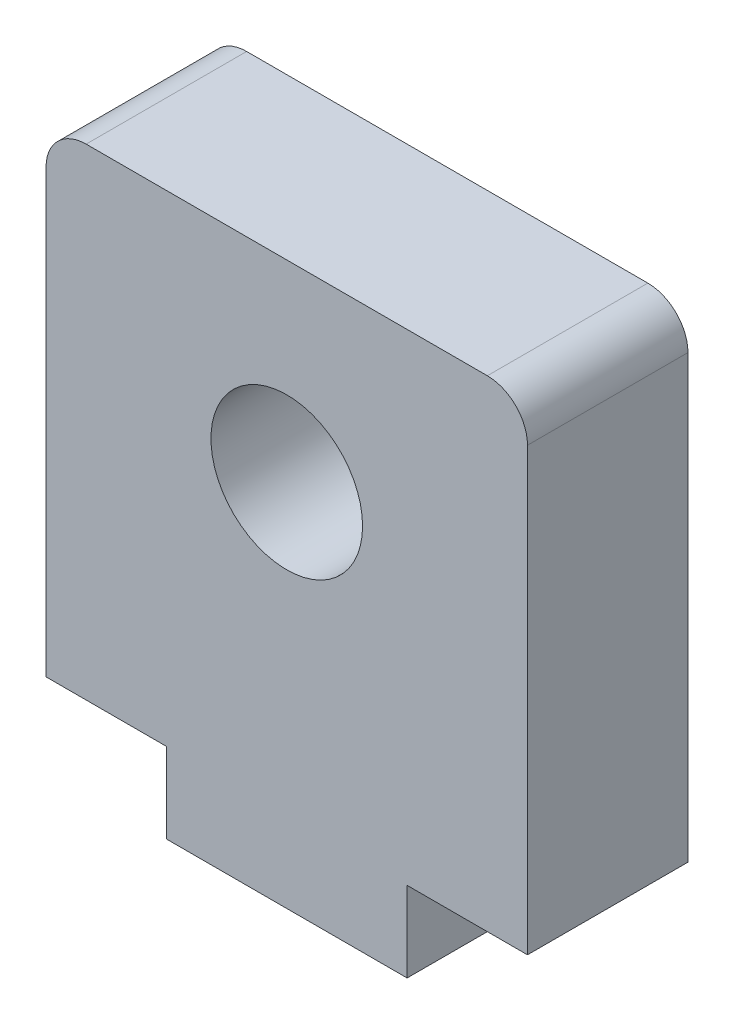
ISO-10303-21;
HEADER;
FILE_DESCRIPTION(('STEP AP214'),'2;1');
FILE_NAME('part.step','',(''),(''),'','','');
FILE_SCHEMA(('AUTOMOTIVE_DESIGN { 1 0 10303 214 1 1 1 1 }'));
ENDSEC;
DATA;
#1=APPLICATION_CONTEXT('core data for automotive mechanical design processes');
#2=APPLICATION_PROTOCOL_DEFINITION('international standard','automotive_design',2000,#1);
#3=PRODUCT_CONTEXT('',#1,'mechanical');
#4=PRODUCT('Part','Part','',(#3));
#5=PRODUCT_RELATED_PRODUCT_CATEGORY('part','',(#4));
#6=PRODUCT_DEFINITION_FORMATION('','',#4);
#7=PRODUCT_DEFINITION_CONTEXT('part definition',#1,'design');
#8=PRODUCT_DEFINITION('design','',#6,#7);
#9=PRODUCT_DEFINITION_SHAPE('','',#8);
#10=(LENGTH_UNIT() NAMED_UNIT(*) SI_UNIT(.MILLI.,.METRE.));
#11=(NAMED_UNIT(*) PLANE_ANGLE_UNIT() SI_UNIT($,.RADIAN.));
#12=(NAMED_UNIT(*) SI_UNIT($,.STERADIAN.) SOLID_ANGLE_UNIT());
#13=UNCERTAINTY_MEASURE_WITH_UNIT(LENGTH_MEASURE(1.E-05),#10,'distance_accuracy_value','');
#14=(GEOMETRIC_REPRESENTATION_CONTEXT(3) GLOBAL_UNCERTAINTY_ASSIGNED_CONTEXT((#13)) GLOBAL_UNIT_ASSIGNED_CONTEXT((#10,
#11,#12)) REPRESENTATION_CONTEXT('',''));
#15=CARTESIAN_POINT('',(0.,0.,0.));
#16=DIRECTION('',(0.,0.,1.));
#17=DIRECTION('',(1.,0.,0.));
#18=AXIS2_PLACEMENT_3D('',#15,#16,#17);
#19=CARTESIAN_POINT('',(-9.525,0.,6.35));
#20=DIRECTION('',(1.,0.,0.));
#21=DIRECTION('',(0.,1.,0.));
#22=AXIS2_PLACEMENT_3D('',#19,#20,#21);
#23=PLANE('',#22);
#24=DIRECTION('',(0.,-1.,0.));
#25=VECTOR('',#24,1.);
#26=CARTESIAN_POINT('',(-9.525,0.,6.35));
#27=LINE('',#26,#25);
#28=CARTESIAN_POINT('',(-9.525,9.52499999999999,6.35));
#29=VERTEX_POINT('',#28);
#30=CARTESIAN_POINT('',(-9.525,-7.93750000000001,6.35));
#31=VERTEX_POINT('',#30);
#32=EDGE_CURVE('E119',#29,#31,#27,.T.);
#33=ORIENTED_EDGE('',*,*,#32,.F.);
#34=DIRECTION('',(0.,0.,-1.));
#35=VECTOR('',#34,1.);
#36=CARTESIAN_POINT('',(-9.525,9.52499999999999,0.));
#37=LINE('',#36,#35);
#38=CARTESIAN_POINT('',(-9.525,9.52499999999999,0.));
#39=VERTEX_POINT('',#38);
#40=EDGE_CURVE('E11',#29,#39,#37,.T.);
#41=ORIENTED_EDGE('',*,*,#40,.T.);
#42=DIRECTION('',(0.,-1.,0.));
#43=VECTOR('',#42,1.);
#44=CARTESIAN_POINT('',(-9.525,0.,0.));
#45=LINE('',#44,#43);
#46=CARTESIAN_POINT('',(-9.525,-7.93750000000001,0.));
#47=VERTEX_POINT('',#46);
#48=EDGE_CURVE('E140',#39,#47,#45,.T.);
#49=ORIENTED_EDGE('',*,*,#48,.T.);
#50=DIRECTION('',(0.,0.,-1.));
#51=VECTOR('',#50,1.);
#52=CARTESIAN_POINT('',(-9.525,-7.93750000000001,6.35));
#53=LINE('',#52,#51);
#54=EDGE_CURVE('E132',#31,#47,#53,.T.);
#55=ORIENTED_EDGE('',*,*,#54,.F.);
#56=EDGE_LOOP('',(#33,#41,#49,#55));
#57=FACE_BOUND('',#56,.T.);
#58=ADVANCED_FACE('F43',(#57),#23,.F.);
#59=CARTESIAN_POINT('',(0.,-7.93750000000001,6.35));
#60=DIRECTION('',(0.,1.,0.));
#61=DIRECTION('',(0.,0.,1.));
#62=AXIS2_PLACEMENT_3D('',#59,#60,#61);
#63=PLANE('',#62);
#64=DIRECTION('',(1.,0.,0.));
#65=VECTOR('',#64,1.);
#66=CARTESIAN_POINT('',(0.,-7.93750000000001,0.));
#67=LINE('',#66,#65);
#68=CARTESIAN_POINT('',(-4.7625,-7.93750000000001,0.));
#69=VERTEX_POINT('',#68);
#70=EDGE_CURVE('E186',#47,#69,#67,.T.);
#71=ORIENTED_EDGE('',*,*,#70,.T.);
#72=DIRECTION('',(0.,0.,-1.));
#73=VECTOR('',#72,1.);
#74=CARTESIAN_POINT('',(-4.7625,-7.93750000000001,6.35));
#75=LINE('',#74,#73);
#76=CARTESIAN_POINT('',(-4.7625,-7.93750000000001,6.35));
#77=VERTEX_POINT('',#76);
#78=EDGE_CURVE('E134',#77,#69,#75,.T.);
#79=ORIENTED_EDGE('',*,*,#78,.F.);
#80=DIRECTION('',(1.,0.,0.));
#81=VECTOR('',#80,1.);
#82=CARTESIAN_POINT('',(0.,-7.93750000000001,6.35));
#83=LINE('',#82,#81);
#84=EDGE_CURVE('E122',#31,#77,#83,.T.);
#85=ORIENTED_EDGE('',*,*,#84,.F.);
#86=ORIENTED_EDGE('',*,*,#54,.T.);
#87=EDGE_LOOP('',(#71,#79,#85,#86));
#88=FACE_BOUND('',#87,.T.);
#89=ADVANCED_FACE('F131',(#88),#63,.F.);
#90=CARTESIAN_POINT('',(-4.7625,0.,6.35));
#91=DIRECTION('',(1.,0.,0.));
#92=DIRECTION('',(0.,0.,-1.));
#93=AXIS2_PLACEMENT_3D('',#90,#91,#92);
#94=PLANE('',#93);
#95=DIRECTION('',(0.,-1.,0.));
#96=VECTOR('',#95,1.);
#97=CARTESIAN_POINT('',(-4.7625,0.,0.));
#98=LINE('',#97,#96);
#99=CARTESIAN_POINT('',(-4.7625,-11.1125,0.));
#100=VERTEX_POINT('',#99);
#101=EDGE_CURVE('E207',#69,#100,#98,.T.);
#102=ORIENTED_EDGE('',*,*,#101,.T.);
#103=DIRECTION('',(0.,0.,-1.));
#104=VECTOR('',#103,1.);
#105=CARTESIAN_POINT('',(-4.7625,-11.1125,6.35));
#106=LINE('',#105,#104);
#107=CARTESIAN_POINT('',(-4.7625,-11.1125,6.35));
#108=VERTEX_POINT('',#107);
#109=EDGE_CURVE('E146',#108,#100,#106,.T.);
#110=ORIENTED_EDGE('',*,*,#109,.F.);
#111=DIRECTION('',(0.,-1.,0.));
#112=VECTOR('',#111,1.);
#113=CARTESIAN_POINT('',(-4.7625,0.,6.35));
#114=LINE('',#113,#112);
#115=EDGE_CURVE('E136',#77,#108,#114,.T.);
#116=ORIENTED_EDGE('',*,*,#115,.F.);
#117=ORIENTED_EDGE('',*,*,#78,.T.);
#118=EDGE_LOOP('',(#102,#110,#116,#117));
#119=FACE_BOUND('',#118,.T.);
#120=ADVANCED_FACE('F243',(#119),#94,.F.);
#121=CARTESIAN_POINT('',(0.,-11.1125,6.35));
#122=DIRECTION('',(0.,1.,0.));
#123=DIRECTION('',(0.,0.,1.));
#124=AXIS2_PLACEMENT_3D('',#121,#122,#123);
#125=PLANE('',#124);
#126=DIRECTION('',(1.,0.,0.));
#127=VECTOR('',#126,1.);
#128=CARTESIAN_POINT('',(0.,-11.1125,0.));
#129=LINE('',#128,#127);
#130=CARTESIAN_POINT('',(4.7625,-11.1125,0.));
#131=VERTEX_POINT('',#130);
#132=EDGE_CURVE('E202',#100,#131,#129,.T.);
#133=ORIENTED_EDGE('',*,*,#132,.T.);
#134=DIRECTION('',(0.,0.,-1.));
#135=VECTOR('',#134,1.);
#136=CARTESIAN_POINT('',(4.7625,-11.1125,6.35));
#137=LINE('',#136,#135);
#138=CARTESIAN_POINT('',(4.7625,-11.1125,6.35));
#139=VERTEX_POINT('',#138);
#140=EDGE_CURVE('E193',#139,#131,#137,.T.);
#141=ORIENTED_EDGE('',*,*,#140,.F.);
#142=DIRECTION('',(1.,0.,0.));
#143=VECTOR('',#142,1.);
#144=CARTESIAN_POINT('',(0.,-11.1125,6.35));
#145=LINE('',#144,#143);
#146=EDGE_CURVE('E204',#108,#139,#145,.T.);
#147=ORIENTED_EDGE('',*,*,#146,.F.);
#148=ORIENTED_EDGE('',*,*,#109,.T.);
#149=EDGE_LOOP('',(#133,#141,#147,#148));
#150=FACE_BOUND('',#149,.T.);
#151=ADVANCED_FACE('F200',(#150),#125,.F.);
#152=CARTESIAN_POINT('',(4.7625,0.,6.35));
#153=DIRECTION('',(1.,0.,0.));
#154=DIRECTION('',(0.,0.,-1.));
#155=AXIS2_PLACEMENT_3D('',#152,#153,#154);
#156=PLANE('',#155);
#157=DIRECTION('',(0.,-1.,0.));
#158=VECTOR('',#157,1.);
#159=CARTESIAN_POINT('',(4.7625,0.,0.));
#160=LINE('',#159,#158);
#161=CARTESIAN_POINT('',(4.7625,-7.93750000000001,0.));
#162=VERTEX_POINT('',#161);
#163=EDGE_CURVE('E184',#162,#131,#160,.T.);
#164=ORIENTED_EDGE('',*,*,#163,.F.);
#165=DIRECTION('',(0.,0.,-1.));
#166=VECTOR('',#165,1.);
#167=CARTESIAN_POINT('',(4.7625,-7.93750000000001,6.35));
#168=LINE('',#167,#166);
#169=CARTESIAN_POINT('',(4.7625,-7.93750000000001,6.35));
#170=VERTEX_POINT('',#169);
#171=EDGE_CURVE('E191',#170,#162,#168,.T.);
#172=ORIENTED_EDGE('',*,*,#171,.F.);
#173=DIRECTION('',(0.,-1.,0.));
#174=VECTOR('',#173,1.);
#175=CARTESIAN_POINT('',(4.7625,0.,6.35));
#176=LINE('',#175,#174);
#177=EDGE_CURVE('E216',#170,#139,#176,.T.);
#178=ORIENTED_EDGE('',*,*,#177,.T.);
#179=ORIENTED_EDGE('',*,*,#140,.T.);
#180=EDGE_LOOP('',(#164,#172,#178,#179));
#181=FACE_BOUND('',#180,.T.);
#182=ADVANCED_FACE('F258',(#181),#156,.T.);
#183=CARTESIAN_POINT('',(9.525,-7.93750000000001,0.));
#184=VERTEX_POINT('',#183);
#185=EDGE_CURVE('E181',#162,#184,#67,.T.);
#186=ORIENTED_EDGE('',*,*,#185,.T.);
#187=DIRECTION('',(0.,0.,-1.));
#188=VECTOR('',#187,1.);
#189=CARTESIAN_POINT('',(9.525,-7.93750000000001,6.35));
#190=LINE('',#189,#188);
#191=CARTESIAN_POINT('',(9.525,-7.93750000000001,6.35));
#192=VERTEX_POINT('',#191);
#193=EDGE_CURVE('E169',#192,#184,#190,.T.);
#194=ORIENTED_EDGE('',*,*,#193,.F.);
#195=EDGE_CURVE('E138',#170,#192,#83,.T.);
#196=ORIENTED_EDGE('',*,*,#195,.F.);
#197=ORIENTED_EDGE('',*,*,#171,.T.);
#198=EDGE_LOOP('',(#186,#194,#196,#197));
#199=FACE_BOUND('',#198,.T.);
#200=ADVANCED_FACE('F245',(#199),#63,.F.);
#201=CARTESIAN_POINT('',(9.525,0.,6.35));
#202=DIRECTION('',(1.,0.,0.));
#203=DIRECTION('',(0.,1.,0.));
#204=AXIS2_PLACEMENT_3D('',#201,#202,#203);
#205=PLANE('',#204);
#206=DIRECTION('',(0.,-1.,0.));
#207=VECTOR('',#206,1.);
#208=CARTESIAN_POINT('',(9.525,0.,0.));
#209=LINE('',#208,#207);
#210=CARTESIAN_POINT('',(9.525,9.52499999999999,0.));
#211=VERTEX_POINT('',#210);
#212=EDGE_CURVE('E175',#211,#184,#209,.T.);
#213=ORIENTED_EDGE('',*,*,#212,.F.);
#214=DIRECTION('',(0.,0.,-1.));
#215=VECTOR('',#214,1.);
#216=CARTESIAN_POINT('',(9.525,9.52499999999999,6.35));
#217=LINE('',#216,#215);
#218=CARTESIAN_POINT('',(9.525,9.52499999999999,6.35));
#219=VERTEX_POINT('',#218);
#220=EDGE_CURVE('E66',#211,#219,#217,.F.);
#221=ORIENTED_EDGE('',*,*,#220,.T.);
#222=DIRECTION('',(0.,-1.,0.));
#223=VECTOR('',#222,1.);
#224=CARTESIAN_POINT('',(9.525,0.,6.35));
#225=LINE('',#224,#223);
#226=EDGE_CURVE('E161',#219,#192,#225,.T.);
#227=ORIENTED_EDGE('',*,*,#226,.T.);
#228=ORIENTED_EDGE('',*,*,#193,.T.);
#229=EDGE_LOOP('',(#213,#221,#227,#228));
#230=FACE_BOUND('',#229,.T.);
#231=ADVANCED_FACE('F178',(#230),#205,.T.);
#232=CARTESIAN_POINT('',(0.,3.49249999999999,6.35));
#233=DIRECTION('',(0.,0.,-1.));
#234=DIRECTION('',(-1.,0.,0.));
#235=AXIS2_PLACEMENT_3D('',#232,#233,#234);
#236=CYLINDRICAL_SURFACE('',#235,3.);
#237=CARTESIAN_POINT('',(0.,3.49249999999999,6.35));
#238=DIRECTION('',(0.,0.,1.));
#239=DIRECTION('',(1.,0.,0.));
#240=AXIS2_PLACEMENT_3D('',#237,#238,#239);
#241=CIRCLE('',#240,3.);
#242=CARTESIAN_POINT('',(3.,3.49249999999999,6.35));
#243=VERTEX_POINT('',#242);
#244=EDGE_CURVE('E127',#243,#243,#241,.T.);
#245=ORIENTED_EDGE('',*,*,#244,.T.);
#246=EDGE_LOOP('',(#245));
#247=FACE_BOUND('',#246,.T.);
#248=CARTESIAN_POINT('',(0.,3.49249999999999,0.));
#249=DIRECTION('',(0.,0.,1.));
#250=DIRECTION('',(1.,0.,0.));
#251=AXIS2_PLACEMENT_3D('',#248,#249,#250);
#252=CIRCLE('',#251,3.);
#253=CARTESIAN_POINT('',(3.,3.49249999999999,0.));
#254=VERTEX_POINT('',#253);
#255=EDGE_CURVE('E212',#254,#254,#252,.T.);
#256=ORIENTED_EDGE('',*,*,#255,.F.);
#257=EDGE_LOOP('',(#256));
#258=FACE_BOUND('',#257,.T.);
#259=ADVANCED_FACE('F224',(#247,#258),#236,.F.);
#260=CARTESIAN_POINT('',(0.,11.1125,6.35));
#261=DIRECTION('',(0.,1.,0.));
#262=DIRECTION('',(-1.,0.,0.));
#263=AXIS2_PLACEMENT_3D('',#260,#261,#262);
#264=PLANE('',#263);
#265=DIRECTION('',(1.,0.,0.));
#266=VECTOR('',#265,1.);
#267=CARTESIAN_POINT('',(0.,11.1125,6.35));
#268=LINE('',#267,#266);
#269=CARTESIAN_POINT('',(-7.9375,11.1125,6.35));
#270=VERTEX_POINT('',#269);
#271=CARTESIAN_POINT('',(7.9375,11.1125,6.35));
#272=VERTEX_POINT('',#271);
#273=EDGE_CURVE('E159',#270,#272,#268,.T.);
#274=ORIENTED_EDGE('',*,*,#273,.T.);
#275=DIRECTION('',(0.,0.,-1.));
#276=VECTOR('',#275,1.);
#277=CARTESIAN_POINT('',(7.9375,11.1125,6.35));
#278=LINE('',#277,#276);
#279=CARTESIAN_POINT('',(7.9375,11.1125,0.));
#280=VERTEX_POINT('',#279);
#281=EDGE_CURVE('E144',#272,#280,#278,.T.);
#282=ORIENTED_EDGE('',*,*,#281,.T.);
#283=DIRECTION('',(1.,0.,0.));
#284=VECTOR('',#283,1.);
#285=CARTESIAN_POINT('',(0.,11.1125,0.));
#286=LINE('',#285,#284);
#287=CARTESIAN_POINT('',(-7.9375,11.1125,0.));
#288=VERTEX_POINT('',#287);
#289=EDGE_CURVE('E177',#288,#280,#286,.T.);
#290=ORIENTED_EDGE('',*,*,#289,.F.);
#291=DIRECTION('',(0.,0.,-1.));
#292=VECTOR('',#291,1.);
#293=CARTESIAN_POINT('',(-7.9375,11.1125,6.35));
#294=LINE('',#293,#292);
#295=EDGE_CURVE('E142',#288,#270,#294,.F.);
#296=ORIENTED_EDGE('',*,*,#295,.T.);
#297=EDGE_LOOP('',(#274,#282,#290,#296));
#298=FACE_BOUND('',#297,.T.);
#299=ADVANCED_FACE('F165',(#298),#264,.T.);
#300=CARTESIAN_POINT('',(0.,0.,6.35));
#301=DIRECTION('',(0.,0.,1.));
#302=DIRECTION('',(1.,0.,0.));
#303=AXIS2_PLACEMENT_3D('',#300,#301,#302);
#304=PLANE('',#303);
#305=ORIENTED_EDGE('',*,*,#244,.F.);
#306=EDGE_LOOP('',(#305));
#307=FACE_BOUND('',#306,.T.);
#308=ORIENTED_EDGE('',*,*,#226,.F.);
#309=CARTESIAN_POINT('',(7.9375,9.52499999999999,6.35));
#310=DIRECTION('',(0.,0.,1.));
#311=DIRECTION('',(1.,0.,0.));
#312=AXIS2_PLACEMENT_3D('',#309,#310,#311);
#313=CIRCLE('',#312,1.5875);
#314=EDGE_CURVE('E51',#219,#272,#313,.T.);
#315=ORIENTED_EDGE('',*,*,#314,.T.);
#316=ORIENTED_EDGE('',*,*,#273,.F.);
#317=CARTESIAN_POINT('',(-7.9375,9.52499999999999,6.35));
#318=DIRECTION('',(0.,0.,1.));
#319=DIRECTION('',(1.,0.,0.));
#320=AXIS2_PLACEMENT_3D('',#317,#318,#319);
#321=CIRCLE('',#320,1.5875);
#322=EDGE_CURVE('E58',#270,#29,#321,.T.);
#323=ORIENTED_EDGE('',*,*,#322,.T.);
#324=ORIENTED_EDGE('',*,*,#32,.T.);
#325=ORIENTED_EDGE('',*,*,#84,.T.);
#326=ORIENTED_EDGE('',*,*,#115,.T.);
#327=ORIENTED_EDGE('',*,*,#146,.T.);
#328=ORIENTED_EDGE('',*,*,#177,.F.);
#329=ORIENTED_EDGE('',*,*,#195,.T.);
#330=EDGE_LOOP('',(#308,#315,#316,#323,#324,#325,#326,#327,#328,#329));
#331=FACE_BOUND('',#330,.T.);
#332=ADVANCED_FACE('F121',(#307,#331),#304,.T.);
#333=CARTESIAN_POINT('',(0.,0.,0.));
#334=DIRECTION('',(0.,0.,1.));
#335=DIRECTION('',(1.,0.,0.));
#336=AXIS2_PLACEMENT_3D('',#333,#334,#335);
#337=PLANE('',#336);
#338=ORIENTED_EDGE('',*,*,#255,.T.);
#339=EDGE_LOOP('',(#338));
#340=FACE_BOUND('',#339,.T.);
#341=ORIENTED_EDGE('',*,*,#289,.T.);
#342=CARTESIAN_POINT('',(7.9375,9.52499999999999,0.));
#343=DIRECTION('',(0.,0.,1.));
#344=DIRECTION('',(1.,0.,0.));
#345=AXIS2_PLACEMENT_3D('',#342,#343,#344);
#346=CIRCLE('',#345,1.5875);
#347=EDGE_CURVE('E154',#280,#211,#346,.F.);
#348=ORIENTED_EDGE('',*,*,#347,.T.);
#349=ORIENTED_EDGE('',*,*,#212,.T.);
#350=ORIENTED_EDGE('',*,*,#185,.F.);
#351=ORIENTED_EDGE('',*,*,#163,.T.);
#352=ORIENTED_EDGE('',*,*,#132,.F.);
#353=ORIENTED_EDGE('',*,*,#101,.F.);
#354=ORIENTED_EDGE('',*,*,#70,.F.);
#355=ORIENTED_EDGE('',*,*,#48,.F.);
#356=CARTESIAN_POINT('',(-7.9375,9.52499999999999,0.));
#357=DIRECTION('',(0.,0.,1.));
#358=DIRECTION('',(1.,0.,0.));
#359=AXIS2_PLACEMENT_3D('',#356,#357,#358);
#360=CIRCLE('',#359,1.5875);
#361=EDGE_CURVE('E152',#39,#288,#360,.F.);
#362=ORIENTED_EDGE('',*,*,#361,.T.);
#363=EDGE_LOOP('',(#341,#348,#349,#350,#351,#352,#353,#354,#355,#362));
#364=FACE_BOUND('',#363,.T.);
#365=ADVANCED_FACE('F173',(#340,#364),#337,.F.);
#366=CARTESIAN_POINT('',(7.9375,9.52499999999999,6.35));
#367=DIRECTION('',(0.,0.,-1.));
#368=DIRECTION('',(-1.,0.,0.));
#369=AXIS2_PLACEMENT_3D('',#366,#367,#368);
#370=CYLINDRICAL_SURFACE('',#369,1.5875);
#371=ORIENTED_EDGE('',*,*,#314,.F.);
#372=ORIENTED_EDGE('',*,*,#220,.F.);
#373=ORIENTED_EDGE('',*,*,#347,.F.);
#374=ORIENTED_EDGE('',*,*,#281,.F.);
#375=EDGE_LOOP('',(#371,#372,#373,#374));
#376=FACE_BOUND('',#375,.T.);
#377=ADVANCED_FACE('F171',(#376),#370,.T.);
#378=CARTESIAN_POINT('',(-7.9375,9.52499999999999,6.35));
#379=DIRECTION('',(0.,0.,1.));
#380=DIRECTION('',(1.,0.,0.));
#381=AXIS2_PLACEMENT_3D('',#378,#379,#380);
#382=CYLINDRICAL_SURFACE('',#381,1.5875);
#383=ORIENTED_EDGE('',*,*,#322,.F.);
#384=ORIENTED_EDGE('',*,*,#295,.F.);
#385=ORIENTED_EDGE('',*,*,#361,.F.);
#386=ORIENTED_EDGE('',*,*,#40,.F.);
#387=EDGE_LOOP('',(#383,#384,#385,#386));
#388=FACE_BOUND('',#387,.T.);
#389=ADVANCED_FACE('F45',(#388),#382,.T.);
#390=CLOSED_SHELL('',(#58,#89,#120,#151,#182,#200,#231,#259,#299,#332,#365,#377,#389));
#391=MANIFOLD_SOLID_BREP('B2',#390);
#392=ADVANCED_BREP_SHAPE_REPRESENTATION('',(#18,#391),#14);
#393=SHAPE_DEFINITION_REPRESENTATION(#9,#392);
ENDSEC;
END-ISO-10303-21;
